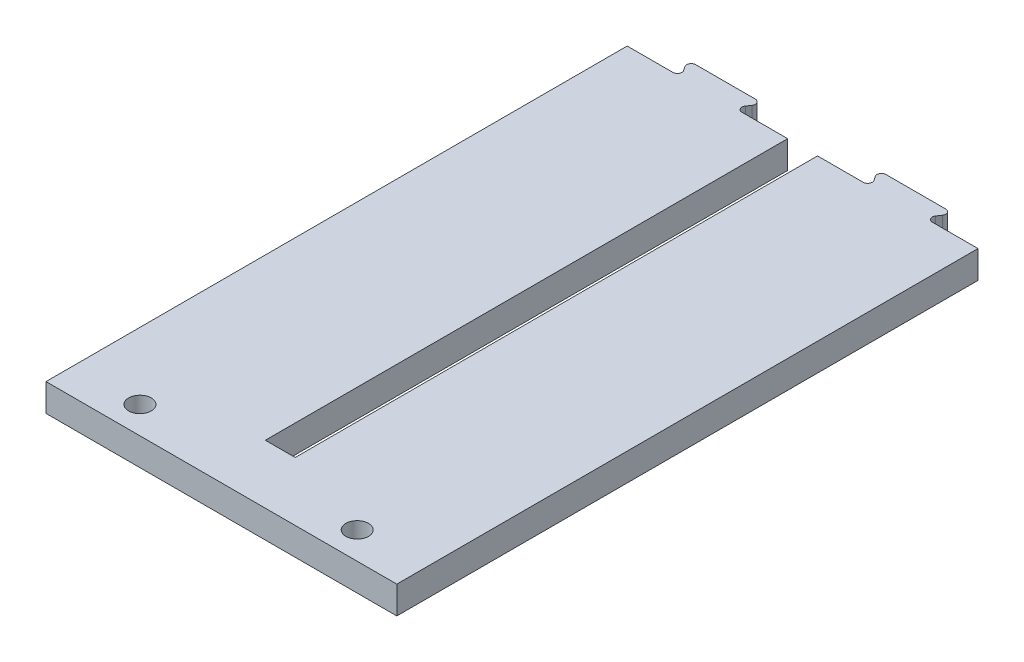
ISO-10303-21;
HEADER;
FILE_DESCRIPTION(('STEP AP214'),'2;1');
FILE_NAME('part.step','',(''),(''),'','','');
FILE_SCHEMA(('AUTOMOTIVE_DESIGN { 1 0 10303 214 1 1 1 1 }'));
ENDSEC;
DATA;
#1=APPLICATION_CONTEXT('core data for automotive mechanical design processes');
#2=APPLICATION_PROTOCOL_DEFINITION('international standard','automotive_design',2000,#1);
#3=PRODUCT_CONTEXT('',#1,'mechanical');
#4=PRODUCT('Part','Part','',(#3));
#5=PRODUCT_RELATED_PRODUCT_CATEGORY('part','',(#4));
#6=PRODUCT_DEFINITION_FORMATION('','',#4);
#7=PRODUCT_DEFINITION_CONTEXT('part definition',#1,'design');
#8=PRODUCT_DEFINITION('design','',#6,#7);
#9=PRODUCT_DEFINITION_SHAPE('','',#8);
#10=(LENGTH_UNIT() NAMED_UNIT(*) SI_UNIT(.MILLI.,.METRE.));
#11=(NAMED_UNIT(*) PLANE_ANGLE_UNIT() SI_UNIT($,.RADIAN.));
#12=(NAMED_UNIT(*) SI_UNIT($,.STERADIAN.) SOLID_ANGLE_UNIT());
#13=UNCERTAINTY_MEASURE_WITH_UNIT(LENGTH_MEASURE(1.E-05),#10,'distance_accuracy_value','');
#14=(GEOMETRIC_REPRESENTATION_CONTEXT(3) GLOBAL_UNCERTAINTY_ASSIGNED_CONTEXT((#13)) GLOBAL_UNIT_ASSIGNED_CONTEXT((#10,
#11,#12)) REPRESENTATION_CONTEXT('',''));
#15=CARTESIAN_POINT('',(0.,0.,0.));
#16=DIRECTION('',(0.,0.,1.));
#17=DIRECTION('',(1.,0.,0.));
#18=AXIS2_PLACEMENT_3D('',#15,#16,#17);
#19=CARTESIAN_POINT('',(-19.375,0.,-64.2));
#20=DIRECTION('',(0.,0.,1.));
#21=DIRECTION('',(1.,0.,0.));
#22=AXIS2_PLACEMENT_3D('',#19,#20,#21);
#23=PLANE('',#22);
#24=DIRECTION('',(1.,0.,0.));
#25=VECTOR('',#24,1.);
#26=CARTESIAN_POINT('',(-19.375,0.,-64.2));
#27=LINE('',#26,#25);
#28=CARTESIAN_POINT('',(14.3304160960855,0.,-64.2));
#29=VERTEX_POINT('',#28);
#30=CARTESIAN_POINT('',(19.375,0.,-64.2));
#31=VERTEX_POINT('',#30);
#32=EDGE_CURVE('E342',#29,#31,#27,.T.);
#33=ORIENTED_EDGE('',*,*,#32,.F.);
#34=DIRECTION('',(0.,1.,0.));
#35=VECTOR('',#34,1.);
#36=CARTESIAN_POINT('',(14.3304160960855,3.05,-64.2));
#37=LINE('',#36,#35);
#38=CARTESIAN_POINT('',(14.3304160960855,3.05,-64.2));
#39=VERTEX_POINT('',#38);
#40=EDGE_CURVE('E269',#29,#39,#37,.T.);
#41=ORIENTED_EDGE('',*,*,#40,.T.);
#42=DIRECTION('',(1.,0.,0.));
#43=VECTOR('',#42,1.);
#44=CARTESIAN_POINT('',(-19.375,3.05,-64.2));
#45=LINE('',#44,#43);
#46=CARTESIAN_POINT('',(19.375,3.05,-64.2));
#47=VERTEX_POINT('',#46);
#48=EDGE_CURVE('E353',#39,#47,#45,.T.);
#49=ORIENTED_EDGE('',*,*,#48,.T.);
#50=DIRECTION('',(0.,1.,0.));
#51=VECTOR('',#50,1.);
#52=CARTESIAN_POINT('',(19.375,0.,-64.2));
#53=LINE('',#52,#51);
#54=EDGE_CURVE('E244',#31,#47,#53,.T.);
#55=ORIENTED_EDGE('',*,*,#54,.F.);
#56=EDGE_LOOP('',(#33,#41,#49,#55));
#57=FACE_BOUND('',#56,.T.);
#58=ADVANCED_FACE('F63',(#57),#23,.F.);
#59=CARTESIAN_POINT('',(1.65,3.05,-64.2));
#60=VERTEX_POINT('',#59);
#61=CARTESIAN_POINT('',(6.69458390391445,3.05,-64.2));
#62=VERTEX_POINT('',#61);
#63=EDGE_CURVE('E345',#60,#62,#45,.T.);
#64=ORIENTED_EDGE('',*,*,#63,.T.);
#65=DIRECTION('',(0.,1.,0.));
#66=VECTOR('',#65,1.);
#67=CARTESIAN_POINT('',(6.69458390391445,0.,-64.2));
#68=LINE('',#67,#66);
#69=CARTESIAN_POINT('',(6.69458390391445,0.,-64.2));
#70=VERTEX_POINT('',#69);
#71=EDGE_CURVE('E310',#62,#70,#68,.F.);
#72=ORIENTED_EDGE('',*,*,#71,.T.);
#73=CARTESIAN_POINT('',(1.65,0.,-64.2));
#74=VERTEX_POINT('',#73);
#75=EDGE_CURVE('E236',#74,#70,#27,.T.);
#76=ORIENTED_EDGE('',*,*,#75,.F.);
#77=DIRECTION('',(0.,-1.,0.));
#78=VECTOR('',#77,1.);
#79=CARTESIAN_POINT('',(1.65,0.,-64.2));
#80=LINE('',#79,#78);
#81=EDGE_CURVE('E266',#60,#74,#80,.T.);
#82=ORIENTED_EDGE('',*,*,#81,.F.);
#83=EDGE_LOOP('',(#64,#72,#76,#82));
#84=FACE_BOUND('',#83,.T.);
#85=ADVANCED_FACE('F454',(#84),#23,.F.);
#86=CARTESIAN_POINT('',(-6.69458390391446,0.,-64.2));
#87=VERTEX_POINT('',#86);
#88=CARTESIAN_POINT('',(-1.65,0.,-64.2));
#89=VERTEX_POINT('',#88);
#90=EDGE_CURVE('E234',#87,#89,#27,.T.);
#91=ORIENTED_EDGE('',*,*,#90,.F.);
#92=DIRECTION('',(0.,1.,0.));
#93=VECTOR('',#92,1.);
#94=CARTESIAN_POINT('',(-6.69458390391446,3.05,-64.2));
#95=LINE('',#94,#93);
#96=CARTESIAN_POINT('',(-6.69458390391446,3.05,-64.2));
#97=VERTEX_POINT('',#96);
#98=EDGE_CURVE('E277',#87,#97,#95,.T.);
#99=ORIENTED_EDGE('',*,*,#98,.T.);
#100=CARTESIAN_POINT('',(-1.65,3.05,-64.2));
#101=VERTEX_POINT('',#100);
#102=EDGE_CURVE('E343',#97,#101,#45,.T.);
#103=ORIENTED_EDGE('',*,*,#102,.T.);
#104=DIRECTION('',(0.,1.,0.));
#105=VECTOR('',#104,1.);
#106=CARTESIAN_POINT('',(-1.65,0.,-64.2));
#107=LINE('',#106,#105);
#108=EDGE_CURVE('E370',#89,#101,#107,.T.);
#109=ORIENTED_EDGE('',*,*,#108,.F.);
#110=EDGE_LOOP('',(#91,#99,#103,#109));
#111=FACE_BOUND('',#110,.T.);
#112=ADVANCED_FACE('F445',(#111),#23,.F.);
#113=CARTESIAN_POINT('',(-19.375,3.05,-64.2));
#114=VERTEX_POINT('',#113);
#115=CARTESIAN_POINT('',(-14.3304160960856,3.05,-64.2));
#116=VERTEX_POINT('',#115);
#117=EDGE_CURVE('E337',#114,#116,#45,.T.);
#118=ORIENTED_EDGE('',*,*,#117,.T.);
#119=DIRECTION('',(0.,1.,0.));
#120=VECTOR('',#119,1.);
#121=CARTESIAN_POINT('',(-14.3304160960856,0.,-64.2));
#122=LINE('',#121,#120);
#123=CARTESIAN_POINT('',(-14.3304160960856,0.,-64.2));
#124=VERTEX_POINT('',#123);
#125=EDGE_CURVE('E231',#116,#124,#122,.F.);
#126=ORIENTED_EDGE('',*,*,#125,.T.);
#127=CARTESIAN_POINT('',(-19.375,0.,-64.2));
#128=VERTEX_POINT('',#127);
#129=EDGE_CURVE('E224',#128,#124,#27,.T.);
#130=ORIENTED_EDGE('',*,*,#129,.F.);
#131=DIRECTION('',(0.,1.,0.));
#132=VECTOR('',#131,1.);
#133=CARTESIAN_POINT('',(-19.375,0.,-64.2));
#134=LINE('',#133,#132);
#135=EDGE_CURVE('E228',#128,#114,#134,.T.);
#136=ORIENTED_EDGE('',*,*,#135,.T.);
#137=EDGE_LOOP('',(#118,#126,#130,#136));
#138=FACE_BOUND('',#137,.T.);
#139=ADVANCED_FACE('F227',(#138),#23,.F.);
#140=CARTESIAN_POINT('',(0.,3.05,0.));
#141=DIRECTION('',(0.,0.,-1.));
#142=DIRECTION('',(-1.,0.,0.));
#143=AXIS2_PLACEMENT_3D('',#140,#141,#142);
#144=PLANE('',#143);
#145=DIRECTION('',(1.,0.,0.));
#146=VECTOR('',#145,1.);
#147=CARTESIAN_POINT('',(0.,0.,0.));
#148=LINE('',#147,#146);
#149=CARTESIAN_POINT('',(-19.375,0.,0.));
#150=VERTEX_POINT('',#149);
#151=CARTESIAN_POINT('',(19.375,0.,0.));
#152=VERTEX_POINT('',#151);
#153=EDGE_CURVE('E250',#150,#152,#148,.T.);
#154=ORIENTED_EDGE('',*,*,#153,.T.);
#155=DIRECTION('',(0.,-1.,0.));
#156=VECTOR('',#155,1.);
#157=CARTESIAN_POINT('',(19.375,3.05,0.));
#158=LINE('',#157,#156);
#159=CARTESIAN_POINT('',(19.375,3.05,0.));
#160=VERTEX_POINT('',#159);
#161=EDGE_CURVE('E263',#160,#152,#158,.T.);
#162=ORIENTED_EDGE('',*,*,#161,.F.);
#163=DIRECTION('',(1.,0.,0.));
#164=VECTOR('',#163,1.);
#165=CARTESIAN_POINT('',(0.,3.05,0.));
#166=LINE('',#165,#164);
#167=CARTESIAN_POINT('',(-19.375,3.05,0.));
#168=VERTEX_POINT('',#167);
#169=EDGE_CURVE('E251',#168,#160,#166,.T.);
#170=ORIENTED_EDGE('',*,*,#169,.F.);
#171=DIRECTION('',(0.,-1.,0.));
#172=VECTOR('',#171,1.);
#173=CARTESIAN_POINT('',(-19.375,3.05,0.));
#174=LINE('',#173,#172);
#175=EDGE_CURVE('E261',#168,#150,#174,.T.);
#176=ORIENTED_EDGE('',*,*,#175,.T.);
#177=EDGE_LOOP('',(#154,#162,#170,#176));
#178=FACE_BOUND('',#177,.T.);
#179=ADVANCED_FACE('F399',(#178),#144,.F.);
#180=CARTESIAN_POINT('',(19.375,3.05,0.));
#181=DIRECTION('',(-1.,0.,0.));
#182=DIRECTION('',(0.,0.,1.));
#183=AXIS2_PLACEMENT_3D('',#180,#181,#182);
#184=PLANE('',#183);
#185=DIRECTION('',(0.,0.,-1.));
#186=VECTOR('',#185,1.);
#187=CARTESIAN_POINT('',(19.375,0.,0.));
#188=LINE('',#187,#186);
#189=EDGE_CURVE('E252',#152,#31,#188,.T.);
#190=ORIENTED_EDGE('',*,*,#189,.T.);
#191=ORIENTED_EDGE('',*,*,#54,.T.);
#192=DIRECTION('',(0.,0.,-1.));
#193=VECTOR('',#192,1.);
#194=CARTESIAN_POINT('',(19.375,3.05,0.));
#195=LINE('',#194,#193);
#196=EDGE_CURVE('E255',#160,#47,#195,.T.);
#197=ORIENTED_EDGE('',*,*,#196,.F.);
#198=ORIENTED_EDGE('',*,*,#161,.T.);
#199=EDGE_LOOP('',(#190,#191,#197,#198));
#200=FACE_BOUND('',#199,.T.);
#201=ADVANCED_FACE('F403',(#200),#184,.F.);
#202=CARTESIAN_POINT('',(-19.375,3.05,0.));
#203=DIRECTION('',(-1.,0.,0.));
#204=DIRECTION('',(0.,0.,1.));
#205=AXIS2_PLACEMENT_3D('',#202,#203,#204);
#206=PLANE('',#205);
#207=ORIENTED_EDGE('',*,*,#135,.F.);
#208=DIRECTION('',(0.,0.,-1.));
#209=VECTOR('',#208,1.);
#210=CARTESIAN_POINT('',(-19.375,0.,0.));
#211=LINE('',#210,#209);
#212=EDGE_CURVE('E241',#150,#128,#211,.T.);
#213=ORIENTED_EDGE('',*,*,#212,.F.);
#214=ORIENTED_EDGE('',*,*,#175,.F.);
#215=DIRECTION('',(0.,0.,-1.));
#216=VECTOR('',#215,1.);
#217=CARTESIAN_POINT('',(-19.375,3.05,0.));
#218=LINE('',#217,#216);
#219=EDGE_CURVE('E243',#168,#114,#218,.T.);
#220=ORIENTED_EDGE('',*,*,#219,.T.);
#221=EDGE_LOOP('',(#207,#213,#214,#220));
#222=FACE_BOUND('',#221,.T.);
#223=ADVANCED_FACE('F240',(#222),#206,.T.);
#224=CARTESIAN_POINT('',(0.,3.05,0.));
#225=DIRECTION('',(0.,1.,0.));
#226=DIRECTION('',(0.,0.,1.));
#227=AXIS2_PLACEMENT_3D('',#224,#225,#226);
#228=PLANE('',#227);
#229=CARTESIAN_POINT('',(-12.,3.05,-3.));
#230=DIRECTION('',(0.,1.,0.));
#231=DIRECTION('',(0.,0.,1.));
#232=AXIS2_PLACEMENT_3D('',#229,#230,#231);
#233=CIRCLE('',#232,1.25);
#234=CARTESIAN_POINT('',(-12.,3.05,-1.75));
#235=VERTEX_POINT('',#234);
#236=EDGE_CURVE('E479',#235,#235,#233,.T.);
#237=ORIENTED_EDGE('',*,*,#236,.F.);
#238=EDGE_LOOP('',(#237));
#239=FACE_BOUND('',#238,.T.);
#240=CARTESIAN_POINT('',(12.,3.05,-3.));
#241=DIRECTION('',(0.,1.,0.));
#242=DIRECTION('',(0.,0.,1.));
#243=AXIS2_PLACEMENT_3D('',#240,#241,#242);
#244=CIRCLE('',#243,1.25);
#245=CARTESIAN_POINT('',(12.,3.05,-1.75));
#246=VERTEX_POINT('',#245);
#247=EDGE_CURVE('E426',#246,#246,#244,.T.);
#248=ORIENTED_EDGE('',*,*,#247,.F.);
#249=EDGE_LOOP('',(#248));
#250=FACE_BOUND('',#249,.T.);
#251=DIRECTION('',(-0.570010804909114,0.,0.821637196265398));
#252=VECTOR('',#251,1.);
#253=CARTESIAN_POINT('',(-21.0382637588669,3.05,-14.5952954827138));
#254=LINE('',#253,#252);
#255=CARTESIAN_POINT('',(14.2179025020472,3.05,-65.4149945975454));
#256=VERTEX_POINT('',#255);
#257=CARTESIAN_POINT('',(13.9195974979529,3.05,-64.9850054024546));
#258=VERTEX_POINT('',#257);
#259=EDGE_CURVE('E413',#256,#258,#254,.T.);
#260=ORIENTED_EDGE('',*,*,#259,.F.);
#261=CARTESIAN_POINT('',(13.8070839039144,3.05,-65.7));
#262=DIRECTION('',(0.,1.,0.));
#263=DIRECTION('',(0.,0.,1.));
#264=AXIS2_PLACEMENT_3D('',#261,#262,#263);
#265=CIRCLE('',#264,0.5);
#266=CARTESIAN_POINT('',(13.8070839039144,3.05,-66.2));
#267=VERTEX_POINT('',#266);
#268=EDGE_CURVE('E291',#256,#267,#265,.T.);
#269=ORIENTED_EDGE('',*,*,#268,.T.);
#270=DIRECTION('',(1.,0.,0.));
#271=VECTOR('',#270,1.);
#272=CARTESIAN_POINT('',(0.,3.05,-66.2));
#273=LINE('',#272,#271);
#274=CARTESIAN_POINT('',(7.21791609608554,3.05,-66.2));
#275=VERTEX_POINT('',#274);
#276=EDGE_CURVE('E419',#275,#267,#273,.T.);
#277=ORIENTED_EDGE('',*,*,#276,.F.);
#278=CARTESIAN_POINT('',(7.21791609608554,3.05,-65.7));
#279=DIRECTION('',(0.,1.,0.));
#280=DIRECTION('',(0.,0.,1.));
#281=AXIS2_PLACEMENT_3D('',#278,#279,#280);
#282=CIRCLE('',#281,0.5);
#283=CARTESIAN_POINT('',(6.80709749795284,3.05,-65.4149945975454));
#284=VERTEX_POINT('',#283);
#285=EDGE_CURVE('E289',#275,#284,#282,.T.);
#286=ORIENTED_EDGE('',*,*,#285,.T.);
#287=DIRECTION('',(-0.570010804909121,0.,-0.821637196265393));
#288=VECTOR('',#287,1.);
#289=CARTESIAN_POINT('',(35.2319822789484,3.05,-24.4421877060207));
#290=LINE('',#289,#288);
#291=CARTESIAN_POINT('',(7.10540250204714,3.05,-64.9850054024546));
#292=VERTEX_POINT('',#291);
#293=EDGE_CURVE('E423',#292,#284,#290,.T.);
#294=ORIENTED_EDGE('',*,*,#293,.F.);
#295=CARTESIAN_POINT('',(6.69458390391445,3.05,-64.7));
#296=DIRECTION('',(0.,1.,0.));
#297=DIRECTION('',(0.,0.,1.));
#298=AXIS2_PLACEMENT_3D('',#295,#296,#297);
#299=CIRCLE('',#298,0.5);
#300=EDGE_CURVE('E331',#292,#62,#299,.F.);
#301=ORIENTED_EDGE('',*,*,#300,.T.);
#302=ORIENTED_EDGE('',*,*,#63,.F.);
#303=DIRECTION('',(0.,0.,-1.));
#304=VECTOR('',#303,1.);
#305=CARTESIAN_POINT('',(1.65,3.05,0.));
#306=LINE('',#305,#304);
#307=CARTESIAN_POINT('',(1.65,3.05,-6.5));
#308=VERTEX_POINT('',#307);
#309=EDGE_CURVE('E386',#308,#60,#306,.T.);
#310=ORIENTED_EDGE('',*,*,#309,.F.);
#311=DIRECTION('',(1.,0.,0.));
#312=VECTOR('',#311,1.);
#313=CARTESIAN_POINT('',(0.,3.05,-6.5));
#314=LINE('',#313,#312);
#315=CARTESIAN_POINT('',(-1.65,3.05,-6.5));
#316=VERTEX_POINT('',#315);
#317=EDGE_CURVE('E374',#316,#308,#314,.T.);
#318=ORIENTED_EDGE('',*,*,#317,.F.);
#319=DIRECTION('',(0.,0.,1.));
#320=VECTOR('',#319,1.);
#321=CARTESIAN_POINT('',(-1.65,3.05,0.));
#322=LINE('',#321,#320);
#323=EDGE_CURVE('E379',#101,#316,#322,.T.);
#324=ORIENTED_EDGE('',*,*,#323,.F.);
#325=ORIENTED_EDGE('',*,*,#102,.F.);
#326=CARTESIAN_POINT('',(-6.69458390391446,3.05,-64.7));
#327=DIRECTION('',(0.,1.,0.));
#328=DIRECTION('',(0.,0.,1.));
#329=AXIS2_PLACEMENT_3D('',#326,#327,#328);
#330=CIRCLE('',#329,0.5);
#331=CARTESIAN_POINT('',(-7.10540250204716,3.05,-64.9850054024546));
#332=VERTEX_POINT('',#331);
#333=EDGE_CURVE('E327',#97,#332,#330,.F.);
#334=ORIENTED_EDGE('',*,*,#333,.T.);
#335=DIRECTION('',(-0.570010804909114,0.,0.821637196265398));
#336=VECTOR('',#335,1.);
#337=CARTESIAN_POINT('',(-35.2319822789483,3.05,-24.4421877060201));
#338=LINE('',#337,#336);
#339=CARTESIAN_POINT('',(-6.80709749795285,3.05,-65.4149945975454));
#340=VERTEX_POINT('',#339);
#341=EDGE_CURVE('E361',#340,#332,#338,.T.);
#342=ORIENTED_EDGE('',*,*,#341,.F.);
#343=CARTESIAN_POINT('',(-7.21791609608555,3.05,-65.7));
#344=DIRECTION('',(0.,1.,0.));
#345=DIRECTION('',(0.,0.,1.));
#346=AXIS2_PLACEMENT_3D('',#343,#344,#345);
#347=CIRCLE('',#346,0.5);
#348=CARTESIAN_POINT('',(-7.21791609608555,3.05,-66.2));
#349=VERTEX_POINT('',#348);
#350=EDGE_CURVE('E287',#340,#349,#347,.T.);
#351=ORIENTED_EDGE('',*,*,#350,.T.);
#352=DIRECTION('',(1.,0.,0.));
#353=VECTOR('',#352,1.);
#354=CARTESIAN_POINT('',(0.,3.05,-66.2));
#355=LINE('',#354,#353);
#356=CARTESIAN_POINT('',(-13.8070839039145,3.05,-66.2));
#357=VERTEX_POINT('',#356);
#358=EDGE_CURVE('E364',#357,#349,#355,.T.);
#359=ORIENTED_EDGE('',*,*,#358,.F.);
#360=CARTESIAN_POINT('',(-13.8070839039145,3.05,-65.7));
#361=DIRECTION('',(0.,1.,0.));
#362=DIRECTION('',(0.,0.,1.));
#363=AXIS2_PLACEMENT_3D('',#360,#361,#362);
#364=CIRCLE('',#363,0.5);
#365=CARTESIAN_POINT('',(-14.2179025020472,3.05,-65.4149945975454));
#366=VERTEX_POINT('',#365);
#367=EDGE_CURVE('E285',#357,#366,#364,.T.);
#368=ORIENTED_EDGE('',*,*,#367,.T.);
#369=DIRECTION('',(-0.570010804909114,0.,-0.821637196265398));
#370=VECTOR('',#369,1.);
#371=CARTESIAN_POINT('',(21.0382637588669,3.05,-14.5952954827138));
#372=LINE('',#371,#370);
#373=CARTESIAN_POINT('',(-13.9195974979529,3.05,-64.9850054024546));
#374=VERTEX_POINT('',#373);
#375=EDGE_CURVE('E339',#374,#366,#372,.T.);
#376=ORIENTED_EDGE('',*,*,#375,.F.);
#377=CARTESIAN_POINT('',(-14.3304160960856,3.05,-64.7));
#378=DIRECTION('',(0.,1.,0.));
#379=DIRECTION('',(0.,0.,1.));
#380=AXIS2_PLACEMENT_3D('',#377,#378,#379);
#381=CIRCLE('',#380,0.5);
#382=EDGE_CURVE('E71',#374,#116,#381,.F.);
#383=ORIENTED_EDGE('',*,*,#382,.T.);
#384=ORIENTED_EDGE('',*,*,#117,.F.);
#385=ORIENTED_EDGE('',*,*,#219,.F.);
#386=ORIENTED_EDGE('',*,*,#169,.T.);
#387=ORIENTED_EDGE('',*,*,#196,.T.);
#388=ORIENTED_EDGE('',*,*,#48,.F.);
#389=CARTESIAN_POINT('',(14.3304160960855,3.05,-64.7));
#390=DIRECTION('',(0.,1.,0.));
#391=DIRECTION('',(0.,0.,1.));
#392=AXIS2_PLACEMENT_3D('',#389,#390,#391);
#393=CIRCLE('',#392,0.5);
#394=EDGE_CURVE('E323',#39,#258,#393,.F.);
#395=ORIENTED_EDGE('',*,*,#394,.T.);
#396=EDGE_LOOP('',(#260,#269,#277,#286,#294,#301,#302,#310,#318,#324,#325,#334,#342,#351,#359,
#368,#376,#383,#384,#385,#386,#387,#388,#395));
#397=FACE_BOUND('',#396,.T.);
#398=ADVANCED_FACE('F336',(#239,#250,#397),#228,.T.);
#399=CARTESIAN_POINT('',(0.,0.,0.));
#400=DIRECTION('',(0.,1.,0.));
#401=DIRECTION('',(0.,0.,1.));
#402=AXIS2_PLACEMENT_3D('',#399,#400,#401);
#403=PLANE('',#402);
#404=CARTESIAN_POINT('',(-12.,0.,-3.));
#405=DIRECTION('',(0.,1.,0.));
#406=DIRECTION('',(0.,0.,1.));
#407=AXIS2_PLACEMENT_3D('',#404,#405,#406);
#408=CIRCLE('',#407,1.25);
#409=CARTESIAN_POINT('',(-12.,0.,-1.75));
#410=VERTEX_POINT('',#409);
#411=EDGE_CURVE('E476',#410,#410,#408,.T.);
#412=ORIENTED_EDGE('',*,*,#411,.T.);
#413=EDGE_LOOP('',(#412));
#414=FACE_BOUND('',#413,.T.);
#415=CARTESIAN_POINT('',(12.,0.,-3.));
#416=DIRECTION('',(0.,1.,0.));
#417=DIRECTION('',(0.,0.,1.));
#418=AXIS2_PLACEMENT_3D('',#415,#416,#417);
#419=CIRCLE('',#418,1.25);
#420=CARTESIAN_POINT('',(12.,0.,-1.75));
#421=VERTEX_POINT('',#420);
#422=EDGE_CURVE('E420',#421,#421,#419,.T.);
#423=ORIENTED_EDGE('',*,*,#422,.T.);
#424=EDGE_LOOP('',(#423));
#425=FACE_BOUND('',#424,.T.);
#426=DIRECTION('',(1.,0.,0.));
#427=VECTOR('',#426,1.);
#428=CARTESIAN_POINT('',(0.,0.,-66.2));
#429=LINE('',#428,#427);
#430=CARTESIAN_POINT('',(7.21791609608554,0.,-66.2));
#431=VERTEX_POINT('',#430);
#432=CARTESIAN_POINT('',(13.8070839039144,0.,-66.2));
#433=VERTEX_POINT('',#432);
#434=EDGE_CURVE('E470',#431,#433,#429,.T.);
#435=ORIENTED_EDGE('',*,*,#434,.T.);
#436=CARTESIAN_POINT('',(13.8070839039144,0.,-65.7));
#437=DIRECTION('',(0.,1.,0.));
#438=DIRECTION('',(0.,0.,1.));
#439=AXIS2_PLACEMENT_3D('',#436,#437,#438);
#440=CIRCLE('',#439,0.5);
#441=CARTESIAN_POINT('',(14.2179025020472,0.,-65.4149945975454));
#442=VERTEX_POINT('',#441);
#443=EDGE_CURVE('E304',#433,#442,#440,.F.);
#444=ORIENTED_EDGE('',*,*,#443,.T.);
#445=DIRECTION('',(-0.570010804909114,0.,0.821637196265398));
#446=VECTOR('',#445,1.);
#447=CARTESIAN_POINT('',(-21.0382637588669,0.,-14.5952954827138));
#448=LINE('',#447,#446);
#449=CARTESIAN_POINT('',(13.9195974979529,0.,-64.9850054024546));
#450=VERTEX_POINT('',#449);
#451=EDGE_CURVE('E431',#442,#450,#448,.T.);
#452=ORIENTED_EDGE('',*,*,#451,.T.);
#453=CARTESIAN_POINT('',(14.3304160960855,0.,-64.7));
#454=DIRECTION('',(0.,1.,0.));
#455=DIRECTION('',(0.,0.,1.));
#456=AXIS2_PLACEMENT_3D('',#453,#454,#455);
#457=CIRCLE('',#456,0.5);
#458=EDGE_CURVE('E325',#450,#29,#457,.T.);
#459=ORIENTED_EDGE('',*,*,#458,.T.);
#460=ORIENTED_EDGE('',*,*,#32,.T.);
#461=ORIENTED_EDGE('',*,*,#189,.F.);
#462=ORIENTED_EDGE('',*,*,#153,.F.);
#463=ORIENTED_EDGE('',*,*,#212,.T.);
#464=ORIENTED_EDGE('',*,*,#129,.T.);
#465=CARTESIAN_POINT('',(-14.3304160960856,0.,-64.7));
#466=DIRECTION('',(0.,1.,0.));
#467=DIRECTION('',(0.,0.,1.));
#468=AXIS2_PLACEMENT_3D('',#465,#466,#467);
#469=CIRCLE('',#468,0.5);
#470=CARTESIAN_POINT('',(-13.9195974979529,0.,-64.9850054024546));
#471=VERTEX_POINT('',#470);
#472=EDGE_CURVE('E12',#124,#471,#469,.T.);
#473=ORIENTED_EDGE('',*,*,#472,.T.);
#474=DIRECTION('',(-0.570010804909114,0.,-0.821637196265398));
#475=VECTOR('',#474,1.);
#476=CARTESIAN_POINT('',(21.0382637588669,0.,-14.5952954827138));
#477=LINE('',#476,#475);
#478=CARTESIAN_POINT('',(-14.2179025020472,0.,-65.4149945975454));
#479=VERTEX_POINT('',#478);
#480=EDGE_CURVE('E348',#471,#479,#477,.T.);
#481=ORIENTED_EDGE('',*,*,#480,.T.);
#482=CARTESIAN_POINT('',(-13.8070839039145,0.,-65.7));
#483=DIRECTION('',(0.,1.,0.));
#484=DIRECTION('',(0.,0.,1.));
#485=AXIS2_PLACEMENT_3D('',#482,#483,#484);
#486=CIRCLE('',#485,0.5);
#487=CARTESIAN_POINT('',(-13.8070839039145,0.,-66.2));
#488=VERTEX_POINT('',#487);
#489=EDGE_CURVE('E298',#479,#488,#486,.F.);
#490=ORIENTED_EDGE('',*,*,#489,.T.);
#491=DIRECTION('',(1.,0.,0.));
#492=VECTOR('',#491,1.);
#493=CARTESIAN_POINT('',(0.,0.,-66.2));
#494=LINE('',#493,#492);
#495=CARTESIAN_POINT('',(-7.21791609608555,0.,-66.2));
#496=VERTEX_POINT('',#495);
#497=EDGE_CURVE('E354',#488,#496,#494,.T.);
#498=ORIENTED_EDGE('',*,*,#497,.T.);
#499=CARTESIAN_POINT('',(-7.21791609608555,0.,-65.7));
#500=DIRECTION('',(0.,1.,0.));
#501=DIRECTION('',(0.,0.,1.));
#502=AXIS2_PLACEMENT_3D('',#499,#500,#501);
#503=CIRCLE('',#502,0.5);
#504=CARTESIAN_POINT('',(-6.80709749795285,0.,-65.4149945975454));
#505=VERTEX_POINT('',#504);
#506=EDGE_CURVE('E300',#496,#505,#503,.F.);
#507=ORIENTED_EDGE('',*,*,#506,.T.);
#508=DIRECTION('',(-0.570010804909114,0.,0.821637196265398));
#509=VECTOR('',#508,1.);
#510=CARTESIAN_POINT('',(-35.2319822789483,0.,-24.4421877060201));
#511=LINE('',#510,#509);
#512=CARTESIAN_POINT('',(-7.10540250204716,0.,-64.9850054024546));
#513=VERTEX_POINT('',#512);
#514=EDGE_CURVE('E357',#505,#513,#511,.T.);
#515=ORIENTED_EDGE('',*,*,#514,.T.);
#516=CARTESIAN_POINT('',(-6.69458390391446,0.,-64.7));
#517=DIRECTION('',(0.,1.,0.));
#518=DIRECTION('',(0.,0.,1.));
#519=AXIS2_PLACEMENT_3D('',#516,#517,#518);
#520=CIRCLE('',#519,0.5);
#521=EDGE_CURVE('E329',#513,#87,#520,.T.);
#522=ORIENTED_EDGE('',*,*,#521,.T.);
#523=ORIENTED_EDGE('',*,*,#90,.T.);
#524=DIRECTION('',(0.,0.,1.));
#525=VECTOR('',#524,1.);
#526=CARTESIAN_POINT('',(-1.65,0.,0.));
#527=LINE('',#526,#525);
#528=CARTESIAN_POINT('',(-1.65,0.,-6.5));
#529=VERTEX_POINT('',#528);
#530=EDGE_CURVE('E382',#89,#529,#527,.T.);
#531=ORIENTED_EDGE('',*,*,#530,.T.);
#532=DIRECTION('',(1.,0.,0.));
#533=VECTOR('',#532,1.);
#534=CARTESIAN_POINT('',(0.,0.,-6.5));
#535=LINE('',#534,#533);
#536=CARTESIAN_POINT('',(1.65,0.,-6.5));
#537=VERTEX_POINT('',#536);
#538=EDGE_CURVE('E375',#529,#537,#535,.T.);
#539=ORIENTED_EDGE('',*,*,#538,.T.);
#540=DIRECTION('',(0.,0.,-1.));
#541=VECTOR('',#540,1.);
#542=CARTESIAN_POINT('',(1.65,0.,0.));
#543=LINE('',#542,#541);
#544=EDGE_CURVE('E378',#537,#74,#543,.T.);
#545=ORIENTED_EDGE('',*,*,#544,.T.);
#546=ORIENTED_EDGE('',*,*,#75,.T.);
#547=CARTESIAN_POINT('',(6.69458390391445,0.,-64.7));
#548=DIRECTION('',(0.,1.,0.));
#549=DIRECTION('',(0.,0.,1.));
#550=AXIS2_PLACEMENT_3D('',#547,#548,#549);
#551=CIRCLE('',#550,0.5);
#552=CARTESIAN_POINT('',(7.10540250204714,0.,-64.9850054024546));
#553=VERTEX_POINT('',#552);
#554=EDGE_CURVE('E85',#70,#553,#551,.T.);
#555=ORIENTED_EDGE('',*,*,#554,.T.);
#556=DIRECTION('',(-0.570010804909121,0.,-0.821637196265393));
#557=VECTOR('',#556,1.);
#558=CARTESIAN_POINT('',(35.2319822789484,0.,-24.4421877060207));
#559=LINE('',#558,#557);
#560=CARTESIAN_POINT('',(6.80709749795284,0.,-65.4149945975454));
#561=VERTEX_POINT('',#560);
#562=EDGE_CURVE('E365',#553,#561,#559,.T.);
#563=ORIENTED_EDGE('',*,*,#562,.T.);
#564=CARTESIAN_POINT('',(7.21791609608554,0.,-65.7));
#565=DIRECTION('',(0.,1.,0.));
#566=DIRECTION('',(0.,0.,1.));
#567=AXIS2_PLACEMENT_3D('',#564,#565,#566);
#568=CIRCLE('',#567,0.5);
#569=EDGE_CURVE('E302',#561,#431,#568,.F.);
#570=ORIENTED_EDGE('',*,*,#569,.T.);
#571=EDGE_LOOP('',(#435,#444,#452,#459,#460,#461,#462,#463,#464,#473,#481,#490,#498,#507,#515,
#522,#523,#531,#539,#545,#546,#555,#563,#570));
#572=FACE_BOUND('',#571,.T.);
#573=ADVANCED_FACE('F248',(#414,#425,#572),#403,.F.);
#574=CARTESIAN_POINT('',(0.,0.,-6.5));
#575=DIRECTION('',(0.,0.,1.));
#576=DIRECTION('',(1.,0.,0.));
#577=AXIS2_PLACEMENT_3D('',#574,#575,#576);
#578=PLANE('',#577);
#579=ORIENTED_EDGE('',*,*,#317,.T.);
#580=DIRECTION('',(0.,1.,0.));
#581=VECTOR('',#580,1.);
#582=CARTESIAN_POINT('',(1.65,0.,-6.5));
#583=LINE('',#582,#581);
#584=EDGE_CURVE('E384',#537,#308,#583,.T.);
#585=ORIENTED_EDGE('',*,*,#584,.F.);
#586=ORIENTED_EDGE('',*,*,#538,.F.);
#587=DIRECTION('',(0.,1.,0.));
#588=VECTOR('',#587,1.);
#589=CARTESIAN_POINT('',(-1.65,0.,-6.5));
#590=LINE('',#589,#588);
#591=EDGE_CURVE('E390',#529,#316,#590,.T.);
#592=ORIENTED_EDGE('',*,*,#591,.T.);
#593=EDGE_LOOP('',(#579,#585,#586,#592));
#594=FACE_BOUND('',#593,.T.);
#595=ADVANCED_FACE('F630',(#594),#578,.F.);
#596=CARTESIAN_POINT('',(-1.65,0.,0.));
#597=DIRECTION('',(-1.,0.,0.));
#598=DIRECTION('',(0.,0.,1.));
#599=AXIS2_PLACEMENT_3D('',#596,#597,#598);
#600=PLANE('',#599);
#601=ORIENTED_EDGE('',*,*,#530,.F.);
#602=ORIENTED_EDGE('',*,*,#108,.T.);
#603=ORIENTED_EDGE('',*,*,#323,.T.);
#604=ORIENTED_EDGE('',*,*,#591,.F.);
#605=EDGE_LOOP('',(#601,#602,#603,#604));
#606=FACE_BOUND('',#605,.T.);
#607=ADVANCED_FACE('F557',(#606),#600,.F.);
#608=CARTESIAN_POINT('',(1.65,0.,0.));
#609=DIRECTION('',(1.,0.,0.));
#610=DIRECTION('',(0.,0.,-1.));
#611=AXIS2_PLACEMENT_3D('',#608,#609,#610);
#612=PLANE('',#611);
#613=ORIENTED_EDGE('',*,*,#309,.T.);
#614=ORIENTED_EDGE('',*,*,#81,.T.);
#615=ORIENTED_EDGE('',*,*,#544,.F.);
#616=ORIENTED_EDGE('',*,*,#584,.T.);
#617=EDGE_LOOP('',(#613,#614,#615,#616));
#618=FACE_BOUND('',#617,.T.);
#619=ADVANCED_FACE('F551',(#618),#612,.F.);
#620=CARTESIAN_POINT('',(-35.2319822789483,0.,-24.4421877060201));
#621=DIRECTION('',(-0.821637196265398,0.,-0.570010804909114));
#622=DIRECTION('',(-0.570010804909114,0.,0.821637196265398));
#623=AXIS2_PLACEMENT_3D('',#620,#621,#622);
#624=PLANE('',#623);
#625=ORIENTED_EDGE('',*,*,#341,.T.);
#626=DIRECTION('',(0.,1.,0.));
#627=VECTOR('',#626,1.);
#628=CARTESIAN_POINT('',(-7.10540250204716,0.,-64.9850054024545));
#629=LINE('',#628,#627);
#630=EDGE_CURVE('E283',#332,#513,#629,.F.);
#631=ORIENTED_EDGE('',*,*,#630,.T.);
#632=ORIENTED_EDGE('',*,*,#514,.F.);
#633=DIRECTION('',(0.,1.,0.));
#634=VECTOR('',#633,1.);
#635=CARTESIAN_POINT('',(-6.80709749795286,0.,-65.4149945975454));
#636=LINE('',#635,#634);
#637=EDGE_CURVE('E280',#505,#340,#636,.T.);
#638=ORIENTED_EDGE('',*,*,#637,.T.);
#639=EDGE_LOOP('',(#625,#631,#632,#638));
#640=FACE_BOUND('',#639,.T.);
#641=ADVANCED_FACE('F549',(#640),#624,.F.);
#642=CARTESIAN_POINT('',(21.0382637588669,0.,-14.5952954827138));
#643=DIRECTION('',(0.821637196265398,0.,-0.570010804909114));
#644=DIRECTION('',(-0.570010804909114,0.,-0.821637196265398));
#645=AXIS2_PLACEMENT_3D('',#642,#643,#644);
#646=PLANE('',#645);
#647=ORIENTED_EDGE('',*,*,#375,.T.);
#648=DIRECTION('',(0.,1.,0.));
#649=VECTOR('',#648,1.);
#650=CARTESIAN_POINT('',(-14.2179025020472,0.,-65.4149945975454));
#651=LINE('',#650,#649);
#652=EDGE_CURVE('E320',#366,#479,#651,.F.);
#653=ORIENTED_EDGE('',*,*,#652,.T.);
#654=ORIENTED_EDGE('',*,*,#480,.F.);
#655=DIRECTION('',(0.,1.,0.));
#656=VECTOR('',#655,1.);
#657=CARTESIAN_POINT('',(-13.9195974979529,3.05,-64.9850054024546));
#658=LINE('',#657,#656);
#659=EDGE_CURVE('E317',#471,#374,#658,.T.);
#660=ORIENTED_EDGE('',*,*,#659,.T.);
#661=EDGE_LOOP('',(#647,#653,#654,#660));
#662=FACE_BOUND('',#661,.T.);
#663=ADVANCED_FACE('F351',(#662),#646,.F.);
#664=CARTESIAN_POINT('',(0.,0.,-66.2));
#665=DIRECTION('',(0.,0.,1.));
#666=DIRECTION('',(1.,0.,0.));
#667=AXIS2_PLACEMENT_3D('',#664,#665,#666);
#668=PLANE('',#667);
#669=ORIENTED_EDGE('',*,*,#358,.T.);
#670=DIRECTION('',(0.,1.,0.));
#671=VECTOR('',#670,1.);
#672=CARTESIAN_POINT('',(-7.21791609608555,0.,-66.2));
#673=LINE('',#672,#671);
#674=EDGE_CURVE('E315',#349,#496,#673,.F.);
#675=ORIENTED_EDGE('',*,*,#674,.T.);
#676=ORIENTED_EDGE('',*,*,#497,.F.);
#677=DIRECTION('',(0.,1.,0.));
#678=VECTOR('',#677,1.);
#679=CARTESIAN_POINT('',(-13.8070839039145,0.,-66.2));
#680=LINE('',#679,#678);
#681=EDGE_CURVE('E312',#488,#357,#680,.T.);
#682=ORIENTED_EDGE('',*,*,#681,.T.);
#683=EDGE_LOOP('',(#669,#675,#676,#682));
#684=FACE_BOUND('',#683,.T.);
#685=ADVANCED_FACE('F546',(#684),#668,.F.);
#686=CARTESIAN_POINT('',(-21.0382637588669,0.,-14.5952954827138));
#687=DIRECTION('',(-0.821637196265398,0.,-0.570010804909114));
#688=DIRECTION('',(-0.570010804909114,0.,0.821637196265398));
#689=AXIS2_PLACEMENT_3D('',#686,#687,#688);
#690=PLANE('',#689);
#691=ORIENTED_EDGE('',*,*,#259,.T.);
#692=DIRECTION('',(0.,1.,0.));
#693=VECTOR('',#692,1.);
#694=CARTESIAN_POINT('',(13.9195974979528,0.,-64.9850054024546));
#695=LINE('',#694,#693);
#696=EDGE_CURVE('E275',#258,#450,#695,.F.);
#697=ORIENTED_EDGE('',*,*,#696,.T.);
#698=ORIENTED_EDGE('',*,*,#451,.F.);
#699=DIRECTION('',(0.,1.,0.));
#700=VECTOR('',#699,1.);
#701=CARTESIAN_POINT('',(14.2179025020471,0.,-65.4149945975454));
#702=LINE('',#701,#700);
#703=EDGE_CURVE('E272',#442,#256,#702,.T.);
#704=ORIENTED_EDGE('',*,*,#703,.T.);
#705=EDGE_LOOP('',(#691,#697,#698,#704));
#706=FACE_BOUND('',#705,.T.);
#707=ADVANCED_FACE('F415',(#706),#690,.F.);
#708=CARTESIAN_POINT('',(35.2319822789484,0.,-24.4421877060207));
#709=DIRECTION('',(0.821637196265393,0.,-0.570010804909121));
#710=DIRECTION('',(-0.570010804909121,0.,-0.821637196265393));
#711=AXIS2_PLACEMENT_3D('',#708,#709,#710);
#712=PLANE('',#711);
#713=ORIENTED_EDGE('',*,*,#562,.F.);
#714=DIRECTION('',(0.,1.,0.));
#715=VECTOR('',#714,1.);
#716=CARTESIAN_POINT('',(7.10540250204714,3.05,-64.9850054024546));
#717=LINE('',#716,#715);
#718=EDGE_CURVE('E307',#553,#292,#717,.T.);
#719=ORIENTED_EDGE('',*,*,#718,.T.);
#720=ORIENTED_EDGE('',*,*,#293,.T.);
#721=DIRECTION('',(0.,1.,0.));
#722=VECTOR('',#721,1.);
#723=CARTESIAN_POINT('',(6.80709749795284,0.,-65.4149945975454));
#724=LINE('',#723,#722);
#725=EDGE_CURVE('E78',#284,#561,#724,.F.);
#726=ORIENTED_EDGE('',*,*,#725,.T.);
#727=EDGE_LOOP('',(#713,#719,#720,#726));
#728=FACE_BOUND('',#727,.T.);
#729=ADVANCED_FACE('F460',(#728),#712,.F.);
#730=CARTESIAN_POINT('',(0.,0.,-66.2));
#731=DIRECTION('',(0.,0.,1.));
#732=DIRECTION('',(1.,0.,0.));
#733=AXIS2_PLACEMENT_3D('',#730,#731,#732);
#734=PLANE('',#733);
#735=ORIENTED_EDGE('',*,*,#276,.T.);
#736=DIRECTION('',(0.,1.,0.));
#737=VECTOR('',#736,1.);
#738=CARTESIAN_POINT('',(13.8070839039144,0.,-66.2));
#739=LINE('',#738,#737);
#740=EDGE_CURVE('E296',#267,#433,#739,.F.);
#741=ORIENTED_EDGE('',*,*,#740,.T.);
#742=ORIENTED_EDGE('',*,*,#434,.F.);
#743=DIRECTION('',(0.,1.,0.));
#744=VECTOR('',#743,1.);
#745=CARTESIAN_POINT('',(7.21791609608554,0.,-66.2));
#746=LINE('',#745,#744);
#747=EDGE_CURVE('E293',#431,#275,#746,.T.);
#748=ORIENTED_EDGE('',*,*,#747,.T.);
#749=EDGE_LOOP('',(#735,#741,#742,#748));
#750=FACE_BOUND('',#749,.T.);
#751=ADVANCED_FACE('F468',(#750),#734,.F.);
#752=CARTESIAN_POINT('',(14.3304160960855,0.,-64.7));
#753=DIRECTION('',(0.,-1.,0.));
#754=DIRECTION('',(0.,0.,-1.));
#755=AXIS2_PLACEMENT_3D('',#752,#753,#754);
#756=CYLINDRICAL_SURFACE('',#755,0.5);
#757=ORIENTED_EDGE('',*,*,#458,.F.);
#758=ORIENTED_EDGE('',*,*,#696,.F.);
#759=ORIENTED_EDGE('',*,*,#394,.F.);
#760=ORIENTED_EDGE('',*,*,#40,.F.);
#761=EDGE_LOOP('',(#757,#758,#759,#760));
#762=FACE_BOUND('',#761,.T.);
#763=ADVANCED_FACE('F410',(#762),#756,.F.);
#764=CARTESIAN_POINT('',(-6.69458390391446,0.,-64.7));
#765=DIRECTION('',(0.,-1.,0.));
#766=DIRECTION('',(0.,0.,-1.));
#767=AXIS2_PLACEMENT_3D('',#764,#765,#766);
#768=CYLINDRICAL_SURFACE('',#767,0.5);
#769=ORIENTED_EDGE('',*,*,#521,.F.);
#770=ORIENTED_EDGE('',*,*,#630,.F.);
#771=ORIENTED_EDGE('',*,*,#333,.F.);
#772=ORIENTED_EDGE('',*,*,#98,.F.);
#773=EDGE_LOOP('',(#769,#770,#771,#772));
#774=FACE_BOUND('',#773,.T.);
#775=ADVANCED_FACE('F442',(#774),#768,.F.);
#776=CARTESIAN_POINT('',(13.8070839039144,0.,-65.7));
#777=DIRECTION('',(0.,1.,0.));
#778=DIRECTION('',(0.,0.,1.));
#779=AXIS2_PLACEMENT_3D('',#776,#777,#778);
#780=CYLINDRICAL_SURFACE('',#779,0.5);
#781=ORIENTED_EDGE('',*,*,#443,.F.);
#782=ORIENTED_EDGE('',*,*,#740,.F.);
#783=ORIENTED_EDGE('',*,*,#268,.F.);
#784=ORIENTED_EDGE('',*,*,#703,.F.);
#785=EDGE_LOOP('',(#781,#782,#783,#784));
#786=FACE_BOUND('',#785,.T.);
#787=ADVANCED_FACE('F528',(#786),#780,.T.);
#788=CARTESIAN_POINT('',(6.69458390391445,0.,-64.7));
#789=DIRECTION('',(0.,-1.,0.));
#790=DIRECTION('',(0.,0.,-1.));
#791=AXIS2_PLACEMENT_3D('',#788,#789,#790);
#792=CYLINDRICAL_SURFACE('',#791,0.5);
#793=ORIENTED_EDGE('',*,*,#554,.F.);
#794=ORIENTED_EDGE('',*,*,#71,.F.);
#795=ORIENTED_EDGE('',*,*,#300,.F.);
#796=ORIENTED_EDGE('',*,*,#718,.F.);
#797=EDGE_LOOP('',(#793,#794,#795,#796));
#798=FACE_BOUND('',#797,.T.);
#799=ADVANCED_FACE('F457',(#798),#792,.F.);
#800=CARTESIAN_POINT('',(7.21791609608554,0.,-65.7));
#801=DIRECTION('',(0.,1.,0.));
#802=DIRECTION('',(0.,0.,1.));
#803=AXIS2_PLACEMENT_3D('',#800,#801,#802);
#804=CYLINDRICAL_SURFACE('',#803,0.5);
#805=ORIENTED_EDGE('',*,*,#569,.F.);
#806=ORIENTED_EDGE('',*,*,#725,.F.);
#807=ORIENTED_EDGE('',*,*,#285,.F.);
#808=ORIENTED_EDGE('',*,*,#747,.F.);
#809=EDGE_LOOP('',(#805,#806,#807,#808));
#810=FACE_BOUND('',#809,.T.);
#811=ADVANCED_FACE('F465',(#810),#804,.T.);
#812=CARTESIAN_POINT('',(-7.21791609608555,0.,-65.7));
#813=DIRECTION('',(0.,1.,0.));
#814=DIRECTION('',(0.,0.,1.));
#815=AXIS2_PLACEMENT_3D('',#812,#813,#814);
#816=CYLINDRICAL_SURFACE('',#815,0.5);
#817=ORIENTED_EDGE('',*,*,#506,.F.);
#818=ORIENTED_EDGE('',*,*,#674,.F.);
#819=ORIENTED_EDGE('',*,*,#350,.F.);
#820=ORIENTED_EDGE('',*,*,#637,.F.);
#821=EDGE_LOOP('',(#817,#818,#819,#820));
#822=FACE_BOUND('',#821,.T.);
#823=ADVANCED_FACE('F536',(#822),#816,.T.);
#824=CARTESIAN_POINT('',(-13.8070839039145,0.,-65.7));
#825=DIRECTION('',(0.,1.,0.));
#826=DIRECTION('',(0.,0.,1.));
#827=AXIS2_PLACEMENT_3D('',#824,#825,#826);
#828=CYLINDRICAL_SURFACE('',#827,0.5);
#829=ORIENTED_EDGE('',*,*,#489,.F.);
#830=ORIENTED_EDGE('',*,*,#652,.F.);
#831=ORIENTED_EDGE('',*,*,#367,.F.);
#832=ORIENTED_EDGE('',*,*,#681,.F.);
#833=EDGE_LOOP('',(#829,#830,#831,#832));
#834=FACE_BOUND('',#833,.T.);
#835=ADVANCED_FACE('F500',(#834),#828,.T.);
#836=CARTESIAN_POINT('',(-14.3304160960856,0.,-64.7));
#837=DIRECTION('',(0.,-1.,0.));
#838=DIRECTION('',(0.,0.,-1.));
#839=AXIS2_PLACEMENT_3D('',#836,#837,#838);
#840=CYLINDRICAL_SURFACE('',#839,0.5);
#841=ORIENTED_EDGE('',*,*,#472,.F.);
#842=ORIENTED_EDGE('',*,*,#125,.F.);
#843=ORIENTED_EDGE('',*,*,#382,.F.);
#844=ORIENTED_EDGE('',*,*,#659,.F.);
#845=EDGE_LOOP('',(#841,#842,#843,#844));
#846=FACE_BOUND('',#845,.T.);
#847=ADVANCED_FACE('F65',(#846),#840,.F.);
#848=CARTESIAN_POINT('',(12.,3.05,-3.));
#849=DIRECTION('',(0.,1.,0.));
#850=DIRECTION('',(0.,0.,1.));
#851=AXIS2_PLACEMENT_3D('',#848,#849,#850);
#852=CYLINDRICAL_SURFACE('',#851,1.25);
#853=ORIENTED_EDGE('',*,*,#422,.F.);
#854=EDGE_LOOP('',(#853));
#855=FACE_BOUND('',#854,.T.);
#856=ORIENTED_EDGE('',*,*,#247,.T.);
#857=EDGE_LOOP('',(#856));
#858=FACE_BOUND('',#857,.T.);
#859=ADVANCED_FACE('F490',(#855,#858),#852,.F.);
#860=CARTESIAN_POINT('',(-12.,3.05,-3.));
#861=DIRECTION('',(0.,1.,0.));
#862=DIRECTION('',(0.,0.,1.));
#863=AXIS2_PLACEMENT_3D('',#860,#861,#862);
#864=CYLINDRICAL_SURFACE('',#863,1.25);
#865=ORIENTED_EDGE('',*,*,#411,.F.);
#866=EDGE_LOOP('',(#865));
#867=FACE_BOUND('',#866,.T.);
#868=ORIENTED_EDGE('',*,*,#236,.T.);
#869=EDGE_LOOP('',(#868));
#870=FACE_BOUND('',#869,.T.);
#871=ADVANCED_FACE('F483',(#867,#870),#864,.F.);
#872=CLOSED_SHELL('',(#58,#85,#112,#139,#179,#201,#223,#398,#573,#595,#607,#619,#641,#663,#685,
#707,#729,#751,#763,#775,#787,#799,#811,#823,#835,#847,#859,#871));
#873=MANIFOLD_SOLID_BREP('B2',#872);
#874=ADVANCED_BREP_SHAPE_REPRESENTATION('',(#18,#873),#14);
#875=SHAPE_DEFINITION_REPRESENTATION(#9,#874);
ENDSEC;
END-ISO-10303-21;
